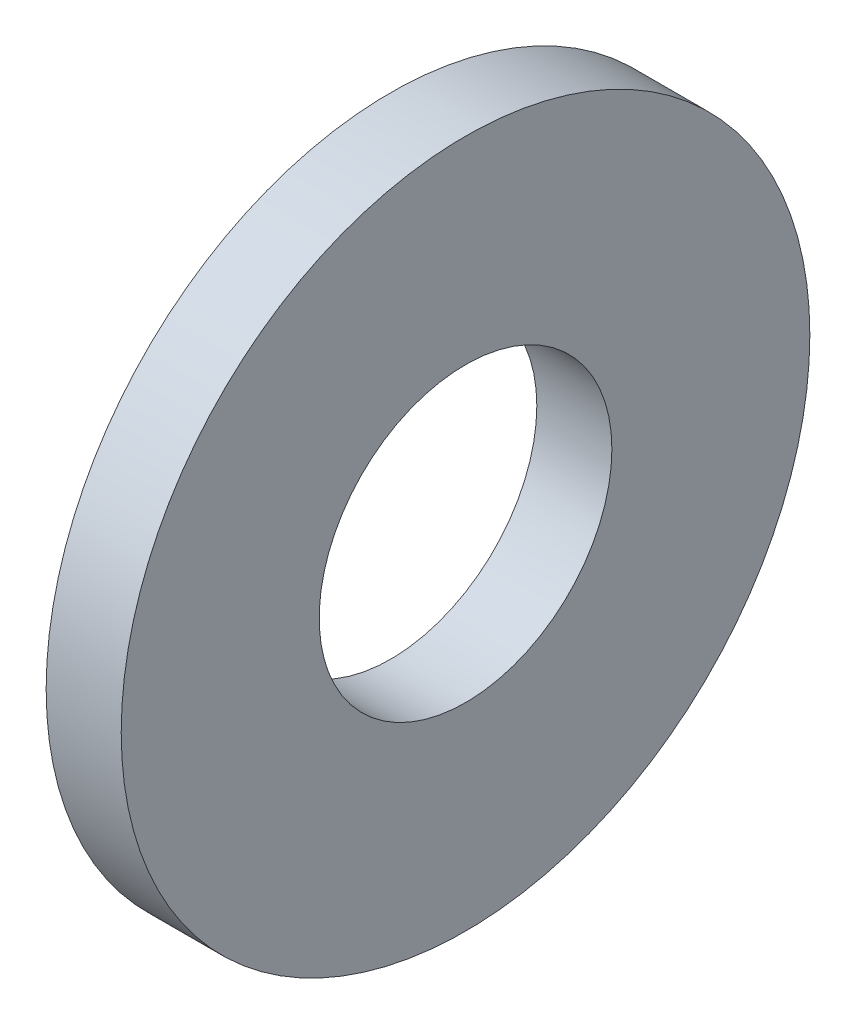
ISO-10303-21;
HEADER;
FILE_DESCRIPTION(('STEP AP214'),'2;1');
FILE_NAME('part.step','',(''),(''),'','','');
FILE_SCHEMA(('AUTOMOTIVE_DESIGN { 1 0 10303 214 1 1 1 1 }'));
ENDSEC;
DATA;
#1=APPLICATION_CONTEXT('core data for automotive mechanical design processes');
#2=APPLICATION_PROTOCOL_DEFINITION('international standard','automotive_design',2000,#1);
#3=PRODUCT_CONTEXT('',#1,'mechanical');
#4=PRODUCT('Part','Part','',(#3));
#5=PRODUCT_RELATED_PRODUCT_CATEGORY('part','',(#4));
#6=PRODUCT_DEFINITION_FORMATION('','',#4);
#7=PRODUCT_DEFINITION_CONTEXT('part definition',#1,'design');
#8=PRODUCT_DEFINITION('design','',#6,#7);
#9=PRODUCT_DEFINITION_SHAPE('','',#8);
#10=(LENGTH_UNIT() NAMED_UNIT(*) SI_UNIT(.MILLI.,.METRE.));
#11=(NAMED_UNIT(*) PLANE_ANGLE_UNIT() SI_UNIT($,.RADIAN.));
#12=(NAMED_UNIT(*) SI_UNIT($,.STERADIAN.) SOLID_ANGLE_UNIT());
#13=UNCERTAINTY_MEASURE_WITH_UNIT(LENGTH_MEASURE(1.E-05),#10,'distance_accuracy_value','');
#14=(GEOMETRIC_REPRESENTATION_CONTEXT(3) GLOBAL_UNCERTAINTY_ASSIGNED_CONTEXT((#13)) GLOBAL_UNIT_ASSIGNED_CONTEXT((#10,
#11,#12)) REPRESENTATION_CONTEXT('',''));
#15=CARTESIAN_POINT('',(0.,0.,0.));
#16=DIRECTION('',(0.,0.,1.));
#17=DIRECTION('',(1.,0.,0.));
#18=AXIS2_PLACEMENT_3D('',#15,#16,#17);
#19=CARTESIAN_POINT('',(2.032,0.,0.));
#20=DIRECTION('',(1.,0.,0.));
#21=DIRECTION('',(0.,0.,-1.));
#22=AXIS2_PLACEMENT_3D('',#19,#20,#21);
#23=PLANE('',#22);
#24=CARTESIAN_POINT('',(2.032,0.,0.));
#25=DIRECTION('',(1.,0.,0.));
#26=DIRECTION('',(0.,0.,-1.));
#27=AXIS2_PLACEMENT_3D('',#24,#25,#26);
#28=CIRCLE('',#27,9.3218);
#29=CARTESIAN_POINT('',(2.032,0.,-9.3218));
#30=VERTEX_POINT('',#29);
#31=EDGE_CURVE('E10',#30,#30,#28,.T.);
#32=ORIENTED_EDGE('',*,*,#31,.T.);
#33=EDGE_LOOP('',(#32));
#34=FACE_BOUND('',#33,.T.);
#35=CARTESIAN_POINT('',(2.032,0.,0.));
#36=DIRECTION('',(1.,0.,0.));
#37=DIRECTION('',(0.,0.,-1.));
#38=AXIS2_PLACEMENT_3D('',#35,#36,#37);
#39=CIRCLE('',#38,3.9624);
#40=CARTESIAN_POINT('',(2.032,0.,-3.9624));
#41=VERTEX_POINT('',#40);
#42=EDGE_CURVE('E50',#41,#41,#39,.T.);
#43=ORIENTED_EDGE('',*,*,#42,.F.);
#44=EDGE_LOOP('',(#43));
#45=FACE_BOUND('',#44,.T.);
#46=ADVANCED_FACE('F39',(#34,#45),#23,.T.);
#47=CARTESIAN_POINT('',(0.,0.,0.));
#48=DIRECTION('',(1.,0.,0.));
#49=DIRECTION('',(0.,0.,-1.));
#50=AXIS2_PLACEMENT_3D('',#47,#48,#49);
#51=PLANE('',#50);
#52=CARTESIAN_POINT('',(0.,0.,0.));
#53=DIRECTION('',(1.,0.,0.));
#54=DIRECTION('',(0.,0.,-1.));
#55=AXIS2_PLACEMENT_3D('',#52,#53,#54);
#56=CIRCLE('',#55,9.3218);
#57=CARTESIAN_POINT('',(0.,0.,-9.3218));
#58=VERTEX_POINT('',#57);
#59=EDGE_CURVE('E43',#58,#58,#56,.T.);
#60=ORIENTED_EDGE('',*,*,#59,.F.);
#61=EDGE_LOOP('',(#60));
#62=FACE_BOUND('',#61,.T.);
#63=CARTESIAN_POINT('',(0.,0.,0.));
#64=DIRECTION('',(1.,0.,0.));
#65=DIRECTION('',(0.,0.,-1.));
#66=AXIS2_PLACEMENT_3D('',#63,#64,#65);
#67=CIRCLE('',#66,3.9624);
#68=CARTESIAN_POINT('',(0.,0.,-3.9624));
#69=VERTEX_POINT('',#68);
#70=EDGE_CURVE('E52',#69,#69,#67,.T.);
#71=ORIENTED_EDGE('',*,*,#70,.T.);
#72=EDGE_LOOP('',(#71));
#73=FACE_BOUND('',#72,.T.);
#74=ADVANCED_FACE('F62',(#62,#73),#51,.F.);
#75=CARTESIAN_POINT('',(2.032,0.,0.));
#76=DIRECTION('',(-1.,0.,0.));
#77=DIRECTION('',(0.,0.,1.));
#78=AXIS2_PLACEMENT_3D('',#75,#76,#77);
#79=CYLINDRICAL_SURFACE('',#78,9.3218);
#80=ORIENTED_EDGE('',*,*,#31,.F.);
#81=EDGE_LOOP('',(#80));
#82=FACE_BOUND('',#81,.T.);
#83=ORIENTED_EDGE('',*,*,#59,.T.);
#84=EDGE_LOOP('',(#83));
#85=FACE_BOUND('',#84,.T.);
#86=ADVANCED_FACE('F41',(#82,#85),#79,.T.);
#87=CARTESIAN_POINT('',(2.032,0.,0.));
#88=DIRECTION('',(-1.,0.,0.));
#89=DIRECTION('',(0.,0.,1.));
#90=AXIS2_PLACEMENT_3D('',#87,#88,#89);
#91=CYLINDRICAL_SURFACE('',#90,3.9624);
#92=ORIENTED_EDGE('',*,*,#42,.T.);
#93=EDGE_LOOP('',(#92));
#94=FACE_BOUND('',#93,.T.);
#95=ORIENTED_EDGE('',*,*,#70,.F.);
#96=EDGE_LOOP('',(#95));
#97=FACE_BOUND('',#96,.T.);
#98=ADVANCED_FACE('F58',(#94,#97),#91,.F.);
#99=CLOSED_SHELL('',(#46,#74,#86,#98));
#100=MANIFOLD_SOLID_BREP('B2',#99);
#101=ADVANCED_BREP_SHAPE_REPRESENTATION('',(#18,#100),#14);
#102=SHAPE_DEFINITION_REPRESENTATION(#9,#101);
ENDSEC;
END-ISO-10303-21;
